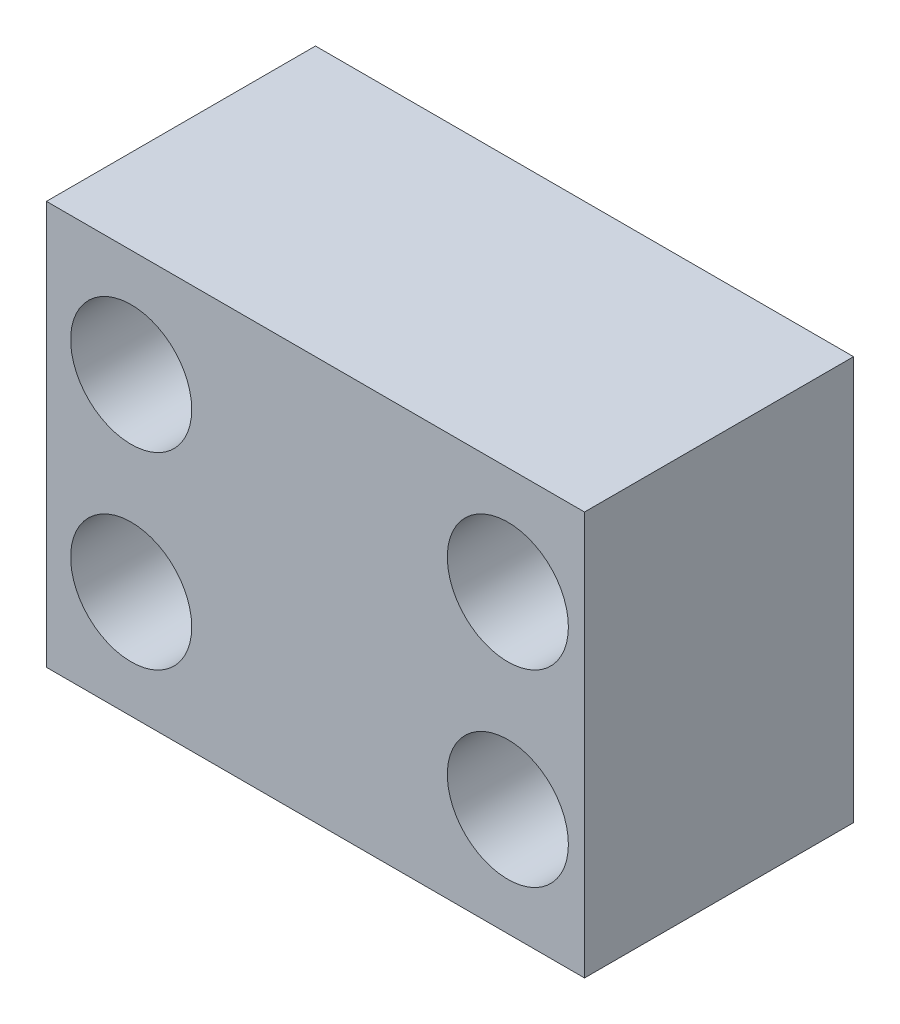
ISO-10303-21;
HEADER;
FILE_DESCRIPTION(('STEP AP214'),'2;1');
FILE_NAME('part.step','',(''),(''),'','','');
FILE_SCHEMA(('AUTOMOTIVE_DESIGN { 1 0 10303 214 1 1 1 1 }'));
ENDSEC;
DATA;
#1=APPLICATION_CONTEXT('core data for automotive mechanical design processes');
#2=APPLICATION_PROTOCOL_DEFINITION('international standard','automotive_design',2000,#1);
#3=PRODUCT_CONTEXT('',#1,'mechanical');
#4=PRODUCT('Part','Part','',(#3));
#5=PRODUCT_RELATED_PRODUCT_CATEGORY('part','',(#4));
#6=PRODUCT_DEFINITION_FORMATION('','',#4);
#7=PRODUCT_DEFINITION_CONTEXT('part definition',#1,'design');
#8=PRODUCT_DEFINITION('design','',#6,#7);
#9=PRODUCT_DEFINITION_SHAPE('','',#8);
#10=(LENGTH_UNIT() NAMED_UNIT(*) SI_UNIT(.MILLI.,.METRE.));
#11=(NAMED_UNIT(*) PLANE_ANGLE_UNIT() SI_UNIT($,.RADIAN.));
#12=(NAMED_UNIT(*) SI_UNIT($,.STERADIAN.) SOLID_ANGLE_UNIT());
#13=UNCERTAINTY_MEASURE_WITH_UNIT(LENGTH_MEASURE(1.E-05),#10,'distance_accuracy_value','');
#14=(GEOMETRIC_REPRESENTATION_CONTEXT(3) GLOBAL_UNCERTAINTY_ASSIGNED_CONTEXT((#13)) GLOBAL_UNIT_ASSIGNED_CONTEXT((#10,
#11,#12)) REPRESENTATION_CONTEXT('',''));
#15=CARTESIAN_POINT('',(0.,0.,0.));
#16=DIRECTION('',(0.,0.,1.));
#17=DIRECTION('',(1.,0.,0.));
#18=AXIS2_PLACEMENT_3D('',#15,#16,#17);
#19=CARTESIAN_POINT('',(100.,-75.,100.));
#20=DIRECTION('',(-1.,0.,0.));
#21=DIRECTION('',(0.,0.,1.));
#22=AXIS2_PLACEMENT_3D('',#19,#20,#21);
#23=PLANE('',#22);
#24=DIRECTION('',(0.,1.,0.));
#25=VECTOR('',#24,1.);
#26=CARTESIAN_POINT('',(100.,-75.,0.));
#27=LINE('',#26,#25);
#28=CARTESIAN_POINT('',(100.,-75.,0.));
#29=VERTEX_POINT('',#28);
#30=CARTESIAN_POINT('',(100.,75.,0.));
#31=VERTEX_POINT('',#30);
#32=EDGE_CURVE('E107',#29,#31,#27,.T.);
#33=ORIENTED_EDGE('',*,*,#32,.T.);
#34=DIRECTION('',(0.,0.,-1.));
#35=VECTOR('',#34,1.);
#36=CARTESIAN_POINT('',(100.,75.,100.));
#37=LINE('',#36,#35);
#38=CARTESIAN_POINT('',(100.,75.,100.));
#39=VERTEX_POINT('',#38);
#40=EDGE_CURVE('E11',#39,#31,#37,.T.);
#41=ORIENTED_EDGE('',*,*,#40,.F.);
#42=DIRECTION('',(0.,1.,0.));
#43=VECTOR('',#42,1.);
#44=CARTESIAN_POINT('',(100.,-75.,100.));
#45=LINE('',#44,#43);
#46=CARTESIAN_POINT('',(100.,-75.,100.));
#47=VERTEX_POINT('',#46);
#48=EDGE_CURVE('E91',#47,#39,#45,.T.);
#49=ORIENTED_EDGE('',*,*,#48,.F.);
#50=DIRECTION('',(0.,0.,-1.));
#51=VECTOR('',#50,1.);
#52=CARTESIAN_POINT('',(100.,-75.,100.));
#53=LINE('',#52,#51);
#54=EDGE_CURVE('E103',#47,#29,#53,.T.);
#55=ORIENTED_EDGE('',*,*,#54,.T.);
#56=EDGE_LOOP('',(#33,#41,#49,#55));
#57=FACE_BOUND('',#56,.T.);
#58=ADVANCED_FACE('F39',(#57),#23,.F.);
#59=CARTESIAN_POINT('',(-100.,75.,100.));
#60=DIRECTION('',(0.,-1.,0.));
#61=DIRECTION('',(0.,0.,-1.));
#62=AXIS2_PLACEMENT_3D('',#59,#60,#61);
#63=PLANE('',#62);
#64=DIRECTION('',(-1.,0.,0.));
#65=VECTOR('',#64,1.);
#66=CARTESIAN_POINT('',(-100.,75.,0.));
#67=LINE('',#66,#65);
#68=CARTESIAN_POINT('',(-100.,75.,0.));
#69=VERTEX_POINT('',#68);
#70=EDGE_CURVE('E96',#31,#69,#67,.T.);
#71=ORIENTED_EDGE('',*,*,#70,.T.);
#72=DIRECTION('',(0.,0.,-1.));
#73=VECTOR('',#72,1.);
#74=CARTESIAN_POINT('',(-100.,75.,100.));
#75=LINE('',#74,#73);
#76=CARTESIAN_POINT('',(-100.,75.,100.));
#77=VERTEX_POINT('',#76);
#78=EDGE_CURVE('E48',#77,#69,#75,.T.);
#79=ORIENTED_EDGE('',*,*,#78,.F.);
#80=DIRECTION('',(-1.,0.,0.));
#81=VECTOR('',#80,1.);
#82=CARTESIAN_POINT('',(-100.,75.,100.));
#83=LINE('',#82,#81);
#84=EDGE_CURVE('E86',#39,#77,#83,.T.);
#85=ORIENTED_EDGE('',*,*,#84,.F.);
#86=ORIENTED_EDGE('',*,*,#40,.T.);
#87=EDGE_LOOP('',(#71,#79,#85,#86));
#88=FACE_BOUND('',#87,.T.);
#89=ADVANCED_FACE('F95',(#88),#63,.F.);
#90=CARTESIAN_POINT('',(-100.,-75.,100.));
#91=DIRECTION('',(1.,0.,0.));
#92=DIRECTION('',(0.,0.,-1.));
#93=AXIS2_PLACEMENT_3D('',#90,#91,#92);
#94=PLANE('',#93);
#95=DIRECTION('',(0.,-1.,0.));
#96=VECTOR('',#95,1.);
#97=CARTESIAN_POINT('',(-100.,-75.,0.));
#98=LINE('',#97,#96);
#99=CARTESIAN_POINT('',(-100.,-75.,0.));
#100=VERTEX_POINT('',#99);
#101=EDGE_CURVE('E73',#69,#100,#98,.T.);
#102=ORIENTED_EDGE('',*,*,#101,.T.);
#103=DIRECTION('',(0.,0.,-1.));
#104=VECTOR('',#103,1.);
#105=CARTESIAN_POINT('',(-100.,-75.,100.));
#106=LINE('',#105,#104);
#107=CARTESIAN_POINT('',(-100.,-75.,100.));
#108=VERTEX_POINT('',#107);
#109=EDGE_CURVE('E98',#108,#100,#106,.T.);
#110=ORIENTED_EDGE('',*,*,#109,.F.);
#111=DIRECTION('',(0.,-1.,0.));
#112=VECTOR('',#111,1.);
#113=CARTESIAN_POINT('',(-100.,-75.,100.));
#114=LINE('',#113,#112);
#115=EDGE_CURVE('E89',#77,#108,#114,.T.);
#116=ORIENTED_EDGE('',*,*,#115,.F.);
#117=ORIENTED_EDGE('',*,*,#78,.T.);
#118=EDGE_LOOP('',(#102,#110,#116,#117));
#119=FACE_BOUND('',#118,.T.);
#120=ADVANCED_FACE('F99',(#119),#94,.F.);
#121=CARTESIAN_POINT('',(-100.,-75.,100.));
#122=DIRECTION('',(0.,1.,0.));
#123=DIRECTION('',(0.,0.,1.));
#124=AXIS2_PLACEMENT_3D('',#121,#122,#123);
#125=PLANE('',#124);
#126=DIRECTION('',(1.,0.,0.));
#127=VECTOR('',#126,1.);
#128=CARTESIAN_POINT('',(-100.,-75.,0.));
#129=LINE('',#128,#127);
#130=EDGE_CURVE('E79',#100,#29,#129,.T.);
#131=ORIENTED_EDGE('',*,*,#130,.T.);
#132=ORIENTED_EDGE('',*,*,#54,.F.);
#133=DIRECTION('',(1.,0.,0.));
#134=VECTOR('',#133,1.);
#135=CARTESIAN_POINT('',(-100.,-75.,100.));
#136=LINE('',#135,#134);
#137=EDGE_CURVE('E56',#108,#47,#136,.T.);
#138=ORIENTED_EDGE('',*,*,#137,.F.);
#139=ORIENTED_EDGE('',*,*,#109,.T.);
#140=EDGE_LOOP('',(#131,#132,#138,#139));
#141=FACE_BOUND('',#140,.T.);
#142=ADVANCED_FACE('F121',(#141),#125,.F.);
#143=CARTESIAN_POINT('',(0.,0.,100.));
#144=DIRECTION('',(0.,0.,-1.));
#145=DIRECTION('',(-1.,0.,0.));
#146=AXIS2_PLACEMENT_3D('',#143,#144,#145);
#147=PLANE('',#146);
#148=CARTESIAN_POINT('',(-68.5,-35.,100.));
#149=DIRECTION('',(0.,0.,1.));
#150=DIRECTION('',(1.,0.,0.));
#151=AXIS2_PLACEMENT_3D('',#148,#149,#150);
#152=CIRCLE('',#151,22.5);
#153=CARTESIAN_POINT('',(-46.,-35.,100.));
#154=VERTEX_POINT('',#153);
#155=EDGE_CURVE('E140',#154,#154,#152,.T.);
#156=ORIENTED_EDGE('',*,*,#155,.F.);
#157=EDGE_LOOP('',(#156));
#158=FACE_BOUND('',#157,.T.);
#159=CARTESIAN_POINT('',(71.5,35.,100.));
#160=DIRECTION('',(0.,0.,1.));
#161=DIRECTION('',(1.,0.,0.));
#162=AXIS2_PLACEMENT_3D('',#159,#160,#161);
#163=CIRCLE('',#162,22.5);
#164=CARTESIAN_POINT('',(94.,35.,100.));
#165=VERTEX_POINT('',#164);
#166=EDGE_CURVE('E141',#165,#165,#163,.T.);
#167=ORIENTED_EDGE('',*,*,#166,.F.);
#168=EDGE_LOOP('',(#167));
#169=FACE_BOUND('',#168,.T.);
#170=CARTESIAN_POINT('',(71.5,-35.,100.));
#171=DIRECTION('',(0.,0.,1.));
#172=DIRECTION('',(1.,0.,0.));
#173=AXIS2_PLACEMENT_3D('',#170,#171,#172);
#174=CIRCLE('',#173,22.5);
#175=CARTESIAN_POINT('',(94.,-35.,100.));
#176=VERTEX_POINT('',#175);
#177=EDGE_CURVE('E155',#176,#176,#174,.T.);
#178=ORIENTED_EDGE('',*,*,#177,.F.);
#179=EDGE_LOOP('',(#178));
#180=FACE_BOUND('',#179,.T.);
#181=CARTESIAN_POINT('',(-68.5,35.,100.));
#182=DIRECTION('',(0.,0.,1.));
#183=DIRECTION('',(1.,0.,0.));
#184=AXIS2_PLACEMENT_3D('',#181,#182,#183);
#185=CIRCLE('',#184,22.5);
#186=CARTESIAN_POINT('',(-46.,35.,100.));
#187=VERTEX_POINT('',#186);
#188=EDGE_CURVE('E131',#187,#187,#185,.T.);
#189=ORIENTED_EDGE('',*,*,#188,.F.);
#190=EDGE_LOOP('',(#189));
#191=FACE_BOUND('',#190,.T.);
#192=ORIENTED_EDGE('',*,*,#48,.T.);
#193=ORIENTED_EDGE('',*,*,#84,.T.);
#194=ORIENTED_EDGE('',*,*,#115,.T.);
#195=ORIENTED_EDGE('',*,*,#137,.T.);
#196=EDGE_LOOP('',(#192,#193,#194,#195));
#197=FACE_BOUND('',#196,.T.);
#198=ADVANCED_FACE('F87',(#158,#169,#180,#191,#197),#147,.F.);
#199=CARTESIAN_POINT('',(0.,0.,0.));
#200=DIRECTION('',(0.,0.,-1.));
#201=DIRECTION('',(-1.,0.,0.));
#202=AXIS2_PLACEMENT_3D('',#199,#200,#201);
#203=PLANE('',#202);
#204=CARTESIAN_POINT('',(-68.5,-35.,0.));
#205=DIRECTION('',(0.,0.,-1.));
#206=DIRECTION('',(-1.,0.,0.));
#207=AXIS2_PLACEMENT_3D('',#204,#205,#206);
#208=CIRCLE('',#207,22.5);
#209=CARTESIAN_POINT('',(-91.,-35.,0.));
#210=VERTEX_POINT('',#209);
#211=EDGE_CURVE('E135',#210,#210,#208,.F.);
#212=ORIENTED_EDGE('',*,*,#211,.T.);
#213=EDGE_LOOP('',(#212));
#214=FACE_BOUND('',#213,.T.);
#215=CARTESIAN_POINT('',(71.5,35.,0.));
#216=DIRECTION('',(0.,0.,-1.));
#217=DIRECTION('',(-1.,0.,0.));
#218=AXIS2_PLACEMENT_3D('',#215,#216,#217);
#219=CIRCLE('',#218,22.5);
#220=CARTESIAN_POINT('',(49.,35.,0.));
#221=VERTEX_POINT('',#220);
#222=EDGE_CURVE('E136',#221,#221,#219,.F.);
#223=ORIENTED_EDGE('',*,*,#222,.T.);
#224=EDGE_LOOP('',(#223));
#225=FACE_BOUND('',#224,.T.);
#226=CARTESIAN_POINT('',(71.5,-35.,0.));
#227=DIRECTION('',(0.,0.,-1.));
#228=DIRECTION('',(-1.,0.,0.));
#229=AXIS2_PLACEMENT_3D('',#226,#227,#228);
#230=CIRCLE('',#229,22.5);
#231=CARTESIAN_POINT('',(49.,-35.,0.));
#232=VERTEX_POINT('',#231);
#233=EDGE_CURVE('E145',#232,#232,#230,.F.);
#234=ORIENTED_EDGE('',*,*,#233,.T.);
#235=EDGE_LOOP('',(#234));
#236=FACE_BOUND('',#235,.T.);
#237=CARTESIAN_POINT('',(-68.5,35.,0.));
#238=DIRECTION('',(0.,0.,-1.));
#239=DIRECTION('',(-1.,0.,0.));
#240=AXIS2_PLACEMENT_3D('',#237,#238,#239);
#241=CIRCLE('',#240,22.5);
#242=CARTESIAN_POINT('',(-91.,35.,0.));
#243=VERTEX_POINT('',#242);
#244=EDGE_CURVE('E111',#243,#243,#241,.F.);
#245=ORIENTED_EDGE('',*,*,#244,.T.);
#246=EDGE_LOOP('',(#245));
#247=FACE_BOUND('',#246,.T.);
#248=ORIENTED_EDGE('',*,*,#32,.F.);
#249=ORIENTED_EDGE('',*,*,#130,.F.);
#250=ORIENTED_EDGE('',*,*,#101,.F.);
#251=ORIENTED_EDGE('',*,*,#70,.F.);
#252=EDGE_LOOP('',(#248,#249,#250,#251));
#253=FACE_BOUND('',#252,.T.);
#254=ADVANCED_FACE('F124',(#214,#225,#236,#247,#253),#203,.T.);
#255=CARTESIAN_POINT('',(-68.5,35.,-63.6396103067893));
#256=DIRECTION('',(0.,0.,1.));
#257=DIRECTION('',(1.,0.,0.));
#258=AXIS2_PLACEMENT_3D('',#255,#256,#257);
#259=CYLINDRICAL_SURFACE('',#258,22.5);
#260=ORIENTED_EDGE('',*,*,#188,.T.);
#261=EDGE_LOOP('',(#260));
#262=FACE_BOUND('',#261,.T.);
#263=ORIENTED_EDGE('',*,*,#244,.F.);
#264=EDGE_LOOP('',(#263));
#265=FACE_BOUND('',#264,.T.);
#266=ADVANCED_FACE('F169',(#262,#265),#259,.F.);
#267=CARTESIAN_POINT('',(71.5,-35.,-63.6396103067893));
#268=DIRECTION('',(0.,0.,1.));
#269=DIRECTION('',(1.,0.,0.));
#270=AXIS2_PLACEMENT_3D('',#267,#268,#269);
#271=CYLINDRICAL_SURFACE('',#270,22.5);
#272=ORIENTED_EDGE('',*,*,#177,.T.);
#273=EDGE_LOOP('',(#272));
#274=FACE_BOUND('',#273,.T.);
#275=ORIENTED_EDGE('',*,*,#233,.F.);
#276=EDGE_LOOP('',(#275));
#277=FACE_BOUND('',#276,.T.);
#278=ADVANCED_FACE('F160',(#274,#277),#271,.F.);
#279=CARTESIAN_POINT('',(71.5,35.,-63.6396103067893));
#280=DIRECTION('',(0.,0.,1.));
#281=DIRECTION('',(1.,0.,0.));
#282=AXIS2_PLACEMENT_3D('',#279,#280,#281);
#283=CYLINDRICAL_SURFACE('',#282,22.5);
#284=ORIENTED_EDGE('',*,*,#166,.T.);
#285=EDGE_LOOP('',(#284));
#286=FACE_BOUND('',#285,.T.);
#287=ORIENTED_EDGE('',*,*,#222,.F.);
#288=EDGE_LOOP('',(#287));
#289=FACE_BOUND('',#288,.T.);
#290=ADVANCED_FACE('F218',(#286,#289),#283,.F.);
#291=CARTESIAN_POINT('',(-68.5,-35.,-63.6396103067893));
#292=DIRECTION('',(0.,0.,1.));
#293=DIRECTION('',(1.,0.,0.));
#294=AXIS2_PLACEMENT_3D('',#291,#292,#293);
#295=CYLINDRICAL_SURFACE('',#294,22.5);
#296=ORIENTED_EDGE('',*,*,#155,.T.);
#297=EDGE_LOOP('',(#296));
#298=FACE_BOUND('',#297,.T.);
#299=ORIENTED_EDGE('',*,*,#211,.F.);
#300=EDGE_LOOP('',(#299));
#301=FACE_BOUND('',#300,.T.);
#302=ADVANCED_FACE('F227',(#298,#301),#295,.F.);
#303=CLOSED_SHELL('',(#58,#89,#120,#142,#198,#254,#266,#278,#290,#302));
#304=MANIFOLD_SOLID_BREP('B2',#303);
#305=ADVANCED_BREP_SHAPE_REPRESENTATION('',(#18,#304),#14);
#306=SHAPE_DEFINITION_REPRESENTATION(#9,#305);
ENDSEC;
END-ISO-10303-21;
